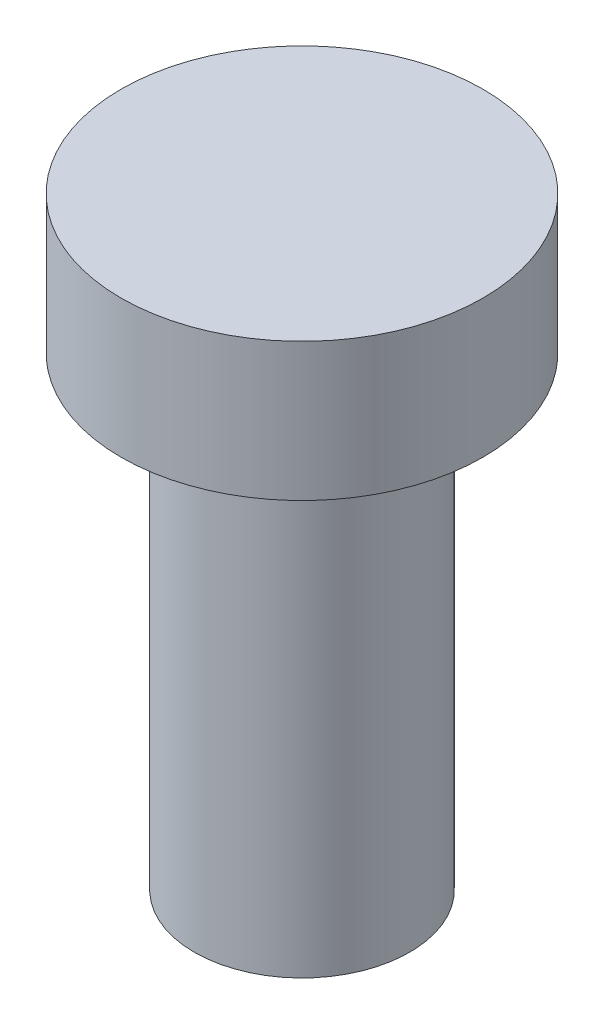
ISO-10303-21;
HEADER;
FILE_DESCRIPTION(('STEP AP214'),'2;1');
FILE_NAME('part.step','',(''),(''),'','','');
FILE_SCHEMA(('AUTOMOTIVE_DESIGN { 1 0 10303 214 1 1 1 1 }'));
ENDSEC;
DATA;
#1=APPLICATION_CONTEXT('core data for automotive mechanical design processes');
#2=APPLICATION_PROTOCOL_DEFINITION('international standard','automotive_design',2000,#1);
#3=PRODUCT_CONTEXT('',#1,'mechanical');
#4=PRODUCT('Part','Part','',(#3));
#5=PRODUCT_RELATED_PRODUCT_CATEGORY('part','',(#4));
#6=PRODUCT_DEFINITION_FORMATION('','',#4);
#7=PRODUCT_DEFINITION_CONTEXT('part definition',#1,'design');
#8=PRODUCT_DEFINITION('design','',#6,#7);
#9=PRODUCT_DEFINITION_SHAPE('','',#8);
#10=(LENGTH_UNIT() NAMED_UNIT(*) SI_UNIT(.MILLI.,.METRE.));
#11=(NAMED_UNIT(*) PLANE_ANGLE_UNIT() SI_UNIT($,.RADIAN.));
#12=(NAMED_UNIT(*) SI_UNIT($,.STERADIAN.) SOLID_ANGLE_UNIT());
#13=UNCERTAINTY_MEASURE_WITH_UNIT(LENGTH_MEASURE(1.E-05),#10,'distance_accuracy_value','');
#14=(GEOMETRIC_REPRESENTATION_CONTEXT(3) GLOBAL_UNCERTAINTY_ASSIGNED_CONTEXT((#13)) GLOBAL_UNIT_ASSIGNED_CONTEXT((#10,
#11,#12)) REPRESENTATION_CONTEXT('',''));
#15=CARTESIAN_POINT('',(0.,0.,0.));
#16=DIRECTION('',(0.,0.,1.));
#17=DIRECTION('',(1.,0.,0.));
#18=AXIS2_PLACEMENT_3D('',#15,#16,#17);
#19=CARTESIAN_POINT('',(0.,1.6,0.));
#20=DIRECTION('',(0.,-1.,0.));
#21=DIRECTION('',(0.,0.,-1.));
#22=AXIS2_PLACEMENT_3D('',#19,#20,#21);
#23=CYLINDRICAL_SURFACE('',#22,2.1);
#24=CARTESIAN_POINT('',(0.,1.6,0.));
#25=DIRECTION('',(0.,1.,0.));
#26=DIRECTION('',(0.,0.,1.));
#27=AXIS2_PLACEMENT_3D('',#24,#25,#26);
#28=CIRCLE('',#27,2.1);
#29=CARTESIAN_POINT('',(0.,1.6,2.1));
#30=VERTEX_POINT('',#29);
#31=EDGE_CURVE('E37',#30,#30,#28,.T.);
#32=ORIENTED_EDGE('',*,*,#31,.F.);
#33=EDGE_LOOP('',(#32));
#34=FACE_BOUND('',#33,.T.);
#35=CARTESIAN_POINT('',(0.,0.,0.));
#36=DIRECTION('',(0.,1.,0.));
#37=DIRECTION('',(0.,0.,1.));
#38=AXIS2_PLACEMENT_3D('',#35,#36,#37);
#39=CIRCLE('',#38,2.1);
#40=CARTESIAN_POINT('',(0.,0.,2.1));
#41=VERTEX_POINT('',#40);
#42=EDGE_CURVE('E33',#41,#41,#39,.T.);
#43=ORIENTED_EDGE('',*,*,#42,.T.);
#44=EDGE_LOOP('',(#43));
#45=FACE_BOUND('',#44,.T.);
#46=ADVANCED_FACE('F30',(#34,#45),#23,.T.);
#47=CARTESIAN_POINT('',(0.,1.6,0.));
#48=DIRECTION('',(0.,1.,0.));
#49=DIRECTION('',(0.,0.,1.));
#50=AXIS2_PLACEMENT_3D('',#47,#48,#49);
#51=PLANE('',#50);
#52=ORIENTED_EDGE('',*,*,#31,.T.);
#53=EDGE_LOOP('',(#52));
#54=FACE_BOUND('',#53,.T.);
#55=ADVANCED_FACE('F54',(#54),#51,.T.);
#56=CARTESIAN_POINT('',(0.,0.,0.));
#57=DIRECTION('',(0.,1.,0.));
#58=DIRECTION('',(0.,0.,1.));
#59=AXIS2_PLACEMENT_3D('',#56,#57,#58);
#60=PLANE('',#59);
#61=CARTESIAN_POINT('',(0.,0.,0.));
#62=DIRECTION('',(0.,-1.,0.));
#63=DIRECTION('',(0.,0.,-1.));
#64=AXIS2_PLACEMENT_3D('',#61,#62,#63);
#65=CIRCLE('',#64,1.25);
#66=CARTESIAN_POINT('',(0.,0.,1.25));
#67=VERTEX_POINT('',#66);
#68=EDGE_CURVE('E10',#67,#67,#65,.T.);
#69=ORIENTED_EDGE('',*,*,#68,.F.);
#70=EDGE_LOOP('',(#69));
#71=FACE_BOUND('',#70,.T.);
#72=ORIENTED_EDGE('',*,*,#42,.F.);
#73=EDGE_LOOP('',(#72));
#74=FACE_BOUND('',#73,.T.);
#75=ADVANCED_FACE('F51',(#71,#74),#60,.F.);
#76=CARTESIAN_POINT('',(0.,-5.4,0.));
#77=DIRECTION('',(0.,1.,0.));
#78=DIRECTION('',(0.,0.,1.));
#79=AXIS2_PLACEMENT_3D('',#76,#77,#78);
#80=CYLINDRICAL_SURFACE('',#79,1.25);
#81=CARTESIAN_POINT('',(0.,-5.4,0.));
#82=DIRECTION('',(0.,-1.,0.));
#83=DIRECTION('',(0.,0.,-1.));
#84=AXIS2_PLACEMENT_3D('',#81,#82,#83);
#85=CIRCLE('',#84,1.25);
#86=CARTESIAN_POINT('',(0.,-5.4,1.25));
#87=VERTEX_POINT('',#86);
#88=EDGE_CURVE('E43',#87,#87,#85,.T.);
#89=CARTESIAN_POINT('',(0.,-5.4,1.25));
#90=CARTESIAN_POINT('',(0.,-5.34375,1.25));
#91=CARTESIAN_POINT('',(0.,-5.2875,1.25));
#92=CARTESIAN_POINT('',(0.,-5.175,1.25));
#93=CARTESIAN_POINT('',(0.,-5.11875,1.25));
#94=CARTESIAN_POINT('',(0.,-5.00625,1.25));
#95=CARTESIAN_POINT('',(0.,-4.95,1.25));
#96=CARTESIAN_POINT('',(0.,-4.8375,1.25));
#97=CARTESIAN_POINT('',(0.,-4.78125,1.25));
#98=CARTESIAN_POINT('',(0.,-4.66875,1.25));
#99=CARTESIAN_POINT('',(0.,-4.6125,1.25));
#100=CARTESIAN_POINT('',(0.,-4.5,1.25));
#101=CARTESIAN_POINT('',(0.,-4.44375,1.25));
#102=CARTESIAN_POINT('',(0.,-4.33125,1.25));
#103=CARTESIAN_POINT('',(0.,-4.275,1.25));
#104=CARTESIAN_POINT('',(0.,-4.1625,1.25));
#105=CARTESIAN_POINT('',(0.,-4.10625,1.25));
#106=CARTESIAN_POINT('',(0.,-3.99375,1.25));
#107=CARTESIAN_POINT('',(0.,-3.9375,1.25));
#108=CARTESIAN_POINT('',(0.,-3.825,1.25));
#109=CARTESIAN_POINT('',(0.,-3.76875,1.25));
#110=CARTESIAN_POINT('',(0.,-3.65625,1.25));
#111=CARTESIAN_POINT('',(0.,-3.6,1.25));
#112=CARTESIAN_POINT('',(0.,-3.4875,1.25));
#113=CARTESIAN_POINT('',(0.,-3.43125,1.25));
#114=CARTESIAN_POINT('',(0.,-3.31875,1.25));
#115=CARTESIAN_POINT('',(0.,-3.2625,1.25));
#116=CARTESIAN_POINT('',(0.,-3.15,1.25));
#117=CARTESIAN_POINT('',(0.,-3.09375,1.25));
#118=CARTESIAN_POINT('',(0.,-2.98125,1.25));
#119=CARTESIAN_POINT('',(0.,-2.925,1.25));
#120=CARTESIAN_POINT('',(0.,-2.8125,1.25));
#121=CARTESIAN_POINT('',(0.,-2.75625,1.25));
#122=CARTESIAN_POINT('',(0.,-2.64375,1.25));
#123=CARTESIAN_POINT('',(0.,-2.5875,1.25));
#124=CARTESIAN_POINT('',(0.,-2.475,1.25));
#125=CARTESIAN_POINT('',(0.,-2.41875,1.25));
#126=CARTESIAN_POINT('',(0.,-2.30625,1.25));
#127=CARTESIAN_POINT('',(0.,-2.25,1.25));
#128=CARTESIAN_POINT('',(0.,-2.1375,1.25));
#129=CARTESIAN_POINT('',(0.,-2.08125,1.25));
#130=CARTESIAN_POINT('',(0.,-1.96875,1.25));
#131=CARTESIAN_POINT('',(0.,-1.9125,1.25));
#132=CARTESIAN_POINT('',(0.,-1.8,1.25));
#133=CARTESIAN_POINT('',(0.,-1.74375,1.25));
#134=CARTESIAN_POINT('',(0.,-1.63125,1.25));
#135=CARTESIAN_POINT('',(0.,-1.575,1.25));
#136=CARTESIAN_POINT('',(0.,-1.4625,1.25));
#137=CARTESIAN_POINT('',(0.,-1.40625,1.25));
#138=CARTESIAN_POINT('',(0.,-1.29375,1.25));
#139=CARTESIAN_POINT('',(0.,-1.2375,1.25));
#140=CARTESIAN_POINT('',(0.,-1.125,1.25));
#141=CARTESIAN_POINT('',(0.,-1.06875,1.25));
#142=CARTESIAN_POINT('',(0.,-0.956249999999999,1.25));
#143=CARTESIAN_POINT('',(0.,-0.899999999999999,1.25));
#144=CARTESIAN_POINT('',(0.,-0.787499999999999,1.25));
#145=CARTESIAN_POINT('',(0.,-0.731249999999999,1.25));
#146=CARTESIAN_POINT('',(0.,-0.618749999999999,1.25));
#147=CARTESIAN_POINT('',(0.,-0.562499999999999,1.25));
#148=CARTESIAN_POINT('',(0.,-0.449999999999999,1.25));
#149=CARTESIAN_POINT('',(0.,-0.393749999999999,1.25));
#150=CARTESIAN_POINT('',(0.,-0.281249999999999,1.25));
#151=CARTESIAN_POINT('',(0.,-0.224999999999999,1.25));
#152=CARTESIAN_POINT('',(0.,-0.112499999999999,1.25));
#153=CARTESIAN_POINT('',(0.,-0.0562499999999989,1.25));
#154=CARTESIAN_POINT('',(0.,0.,1.25));
#155=B_SPLINE_CURVE_WITH_KNOTS('',3,(#89,#90,#91,#92,#93,#94,#95,#96,#97,#98,#99,#100,#101,#102,
#103,#104,#105,#106,#107,#108,#109,#110,#111,#112,#113,#114,#115,#116,#117,#118,#119,#120,#121,
#122,#123,#124,#125,#126,#127,#128,#129,#130,#131,#132,#133,#134,#135,#136,#137,#138,#139,#140,
#141,#142,#143,#144,#145,#146,#147,#148,#149,#150,#151,#152,#153,#154),.UNSPECIFIED.,.F.,.F.,(4,
2,2,2,2,2,2,2,2,2,2,2,2,2,2,2,2,2,2,2,2,2,2,2,2,2,2,2,2,2,2,2,4),(0.,0.16875,0.337499999999999,
0.50625,0.674999999999999,0.84375,1.0125,1.18125,1.35,1.51875,1.6875,1.85625,2.025,2.19375,
2.3625,2.53125,2.7,2.86875,3.0375,3.20625,3.375,3.54375,3.7125,3.88125,4.05,4.21875,4.3875,
4.55625,4.725,4.89375,5.0625,5.23125,5.4),.UNSPECIFIED.);
#156=EDGE_CURVE('BSEAM53',#87,#67,#155,.T.);
#157=ORIENTED_EDGE('',*,*,#88,.F.);
#158=ORIENTED_EDGE('',*,*,#68,.T.);
#159=ORIENTED_EDGE('',*,*,#156,.T.);
#160=ORIENTED_EDGE('',*,*,#156,.F.);
#161=EDGE_LOOP('',(#157,#159,#158,#160));
#162=FACE_BOUND('',#161,.T.);
#163=ADVANCED_FACE('F53',(#162),#80,.T.);
#164=CARTESIAN_POINT('',(0.,-5.4,0.));
#165=DIRECTION('',(0.,-1.,0.));
#166=DIRECTION('',(0.,0.,-1.));
#167=AXIS2_PLACEMENT_3D('',#164,#165,#166);
#168=PLANE('',#167);
#169=ORIENTED_EDGE('',*,*,#88,.T.);
#170=EDGE_LOOP('',(#169));
#171=FACE_BOUND('',#170,.T.);
#172=ADVANCED_FACE('F60',(#171),#168,.T.);
#173=CLOSED_SHELL('',(#46,#55,#75,#163,#172));
#174=MANIFOLD_SOLID_BREP('B2',#173);
#175=ADVANCED_BREP_SHAPE_REPRESENTATION('',(#18,#174),#14);
#176=SHAPE_DEFINITION_REPRESENTATION(#9,#175);
ENDSEC;
END-ISO-10303-21;
